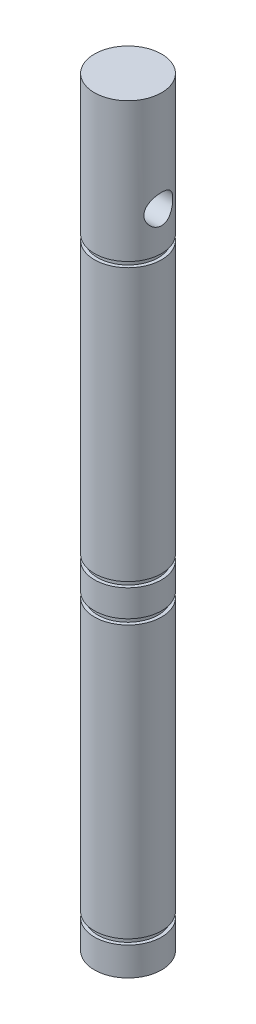
ISO-10303-21;
HEADER;
FILE_DESCRIPTION(('STEP AP214'),'2;1');
FILE_NAME('part.step','',(''),(''),'','','');
FILE_SCHEMA(('AUTOMOTIVE_DESIGN { 1 0 10303 214 1 1 1 1 }'));
ENDSEC;
DATA;
#1=APPLICATION_CONTEXT('core data for automotive mechanical design processes');
#2=APPLICATION_PROTOCOL_DEFINITION('international standard','automotive_design',2000,#1);
#3=PRODUCT_CONTEXT('',#1,'mechanical');
#4=PRODUCT('Part','Part','',(#3));
#5=PRODUCT_RELATED_PRODUCT_CATEGORY('part','',(#4));
#6=PRODUCT_DEFINITION_FORMATION('','',#4);
#7=PRODUCT_DEFINITION_CONTEXT('part definition',#1,'design');
#8=PRODUCT_DEFINITION('design','',#6,#7);
#9=PRODUCT_DEFINITION_SHAPE('','',#8);
#10=(LENGTH_UNIT() NAMED_UNIT(*) SI_UNIT(.MILLI.,.METRE.));
#11=(NAMED_UNIT(*) PLANE_ANGLE_UNIT() SI_UNIT($,.RADIAN.));
#12=(NAMED_UNIT(*) SI_UNIT($,.STERADIAN.) SOLID_ANGLE_UNIT());
#13=UNCERTAINTY_MEASURE_WITH_UNIT(LENGTH_MEASURE(1.E-05),#10,'distance_accuracy_value','');
#14=(GEOMETRIC_REPRESENTATION_CONTEXT(3) GLOBAL_UNCERTAINTY_ASSIGNED_CONTEXT((#13)) GLOBAL_UNIT_ASSIGNED_CONTEXT((#10,
#11,#12)) REPRESENTATION_CONTEXT('',''));
#15=CARTESIAN_POINT('',(0.,0.,0.));
#16=DIRECTION('',(0.,0.,1.));
#17=DIRECTION('',(1.,0.,0.));
#18=AXIS2_PLACEMENT_3D('',#15,#16,#17);
#19=CARTESIAN_POINT('',(0.,113.2,0.));
#20=DIRECTION('',(0.,-1.,0.));
#21=DIRECTION('',(0.,0.,-1.));
#22=AXIS2_PLACEMENT_3D('',#19,#20,#21);
#23=CYLINDRICAL_SURFACE('',#22,5.);
#24=CARTESIAN_POINT('',(5.,96.05,0.));
#25=CARTESIAN_POINT('',(4.99999621998049,96.0500047044788,0.114835545396068));
#26=CARTESIAN_POINT('',(4.99599926166422,96.0592544770341,0.229860735310637));
#27=CARTESIAN_POINT('',(4.98040992717606,96.0958968501132,0.456623046054586));
#28=CARTESIAN_POINT('',(4.96879845529822,96.1233350655641,0.568351160380434));
#29=CARTESIAN_POINT('',(4.93921683063638,96.1951496578611,0.784879505774936));
#30=CARTESIAN_POINT('',(4.92126879357173,96.2394671648934,0.889702346503161));
#31=CARTESIAN_POINT('',(4.88074740348192,96.3435285740351,1.09031746778291));
#32=CARTESIAN_POINT('',(4.85817528603951,96.4032683563248,1.18611215075088));
#33=CARTESIAN_POINT('',(4.80931422599573,96.5398020552537,1.37116513207813));
#34=CARTESIAN_POINT('',(4.78289851739489,96.6172795980927,1.45988525446503));
#35=CARTESIAN_POINT('',(4.72985518336361,96.7856413295159,1.62354093158267));
#36=CARTESIAN_POINT('',(4.70322744813478,96.8765329583648,1.69846878411878));
#37=CARTESIAN_POINT('',(4.65118303365362,97.0749943786449,1.8363607737916));
#38=CARTESIAN_POINT('',(4.62590609619846,97.1831941178272,1.89847662030886));
#39=CARTESIAN_POINT('',(4.5814531572261,97.4097462625302,2.00338646719045));
#40=CARTESIAN_POINT('',(4.56227381433804,97.5280930623435,2.04619105518083));
#41=CARTESIAN_POINT('',(4.53356873023215,97.7653850831066,2.10900450199364));
#42=CARTESIAN_POINT('',(4.52360556242213,97.8840001665593,2.13005258632579));
#43=CARTESIAN_POINT('',(4.51321267854591,98.1234645315574,2.15199319346716));
#44=CARTESIAN_POINT('',(4.51277719968365,98.2443124183203,2.15289789994809));
#45=CARTESIAN_POINT('',(4.52112117843054,98.4741381117304,2.1353050819531));
#46=CARTESIAN_POINT('',(4.52914196291459,98.5832714362591,2.11840504210957));
#47=CARTESIAN_POINT('',(4.55220547150226,98.7969689407392,2.06837520115208));
#48=CARTESIAN_POINT('',(4.56724964634381,98.9015321718185,2.03524204688745));
#49=CARTESIAN_POINT('',(4.60301000794308,99.105846989488,1.95303304687024));
#50=CARTESIAN_POINT('',(4.62384314004412,99.2054431571,1.90362411014709));
#51=CARTESIAN_POINT('',(4.6688110843489,99.3953345572334,1.79050331872356));
#52=CARTESIAN_POINT('',(4.69294724198725,99.4856259732038,1.72678562876736));
#53=CARTESIAN_POINT('',(4.74445845462428,99.6629521400752,1.58008857979551));
#54=CARTESIAN_POINT('',(4.77192887641005,99.7489514012745,1.49588741013984));
#55=CARTESIAN_POINT('',(4.82518045571716,99.9059691101634,1.31400448557392));
#56=CARTESIAN_POINT('',(4.85096116369323,99.9769835822411,1.2163191645282));
#57=CARTESIAN_POINT('',(4.8987679201725,100.103671228195,1.00691935021166));
#58=CARTESIAN_POINT('',(4.92067875720504,100.158896915273,0.894905848347731));
#59=CARTESIAN_POINT('',(4.95738082524822,100.24935221564,0.661994575906467));
#60=CARTESIAN_POINT('',(4.97217625256345,100.28459361684,0.541102090315633));
#61=CARTESIAN_POINT('',(4.99218074053255,100.33185191464,0.30249524146415));
#62=CARTESIAN_POINT('',(4.99796163404824,100.345256831367,0.185103758094274));
#63=CARTESIAN_POINT('',(5.00113087228178,100.352632295532,-0.050385312493932));
#64=CARTESIAN_POINT('',(4.99852182973699,100.346608893204,-0.168482668461244));
#65=CARTESIAN_POINT('',(4.98557160987261,100.316268481486,-0.395356668788955));
#66=CARTESIAN_POINT('',(4.97565231069721,100.292949172702,-0.50429363929419));
#67=CARTESIAN_POINT('',(4.94954183986369,100.230093262762,-0.716575344965289));
#68=CARTESIAN_POINT('',(4.93334988932626,100.19055464761,-0.819919383836166));
#69=CARTESIAN_POINT('',(4.89560311095936,100.095100853109,-1.02173568510502));
#70=CARTESIAN_POINT('',(4.87389656436943,100.038712705671,-1.11995493542662));
#71=CARTESIAN_POINT('',(4.82740593804048,99.9116774475739,-1.3058912611821));
#72=CARTESIAN_POINT('',(4.80262054337022,99.841024236401,-1.39360381772883));
#73=CARTESIAN_POINT('',(4.75030042593853,99.6812071479933,-1.56304009280931));
#74=CARTESIAN_POINT('',(4.7226997621419,99.5910457233874,-1.6438049355674));
#75=CARTESIAN_POINT('',(4.6695010423979,99.3980537215631,-1.7893516390723));
#76=CARTESIAN_POINT('',(4.64390355770015,99.2952195518092,-1.85412895189171));
#77=CARTESIAN_POINT('',(4.59732368381386,99.0771606660576,-1.96682915971184));
#78=CARTESIAN_POINT('',(4.57643497069984,98.9617426370537,-2.01441968381344));
#79=CARTESIAN_POINT('',(4.54285491722175,98.7233441971442,-2.08906077585787));
#80=CARTESIAN_POINT('',(4.53015622299322,98.6003706793471,-2.11612977403899));
#81=CARTESIAN_POINT('',(4.51556674498243,98.3610593110872,-2.14707307446202));
#82=CARTESIAN_POINT('',(4.51288536016702,98.24498849191,-2.15264527247689));
#83=CARTESIAN_POINT('',(4.51651061446972,98.0136196060097,-2.14502948633772));
#84=CARTESIAN_POINT('',(4.52281564143703,97.8983214044079,-2.13184486713354));
#85=CARTESIAN_POINT('',(4.54296104026491,97.6780657696047,-2.08854577765756));
#86=CARTESIAN_POINT('',(4.55638618236671,97.5728837290044,-2.05936148235166));
#87=CARTESIAN_POINT('',(4.58890714169607,97.3689016126893,-1.9858344356092));
#88=CARTESIAN_POINT('',(4.60800457331424,97.2701033636254,-1.94148736815147));
#89=CARTESIAN_POINT('',(4.65118848736616,97.0749779832801,-1.83572779733721));
#90=CARTESIAN_POINT('',(4.67551133474211,96.9791863999066,-1.77342570095996));
#91=CARTESIAN_POINT('',(4.72579153701387,96.798887648242,-1.63472692327571));
#92=CARTESIAN_POINT('',(4.75174951340188,96.714384809212,-1.55832486119464));
#93=CARTESIAN_POINT('',(4.80485732878053,96.5521235524419,-1.38638416406729));
#94=CARTESIAN_POINT('',(4.83193739760635,96.4754385713969,-1.28980595429324));
#95=CARTESIAN_POINT('',(4.88218823950585,96.3392808406513,-1.0841702666847));
#96=CARTESIAN_POINT('',(4.90535723816785,96.2798158947941,-0.975107162038187));
#97=CARTESIAN_POINT('',(4.9448973698972,96.1809562451619,-0.748982994819753));
#98=CARTESIAN_POINT('',(4.96136104370252,96.1412864900523,-0.632058730569331));
#99=CARTESIAN_POINT('',(4.9860123741463,96.0825624339776,-0.392520511405341));
#100=CARTESIAN_POINT('',(4.99422563086537,96.0634443505432,-0.269925398746322));
#101=CARTESIAN_POINT('',(4.99856494592615,96.0533399520735,-0.122288490351509));
#102=CARTESIAN_POINT('',(4.99910224315886,96.0520885408935,-0.0978529891005524));
#103=CARTESIAN_POINT('',(4.99982017425342,96.0504180606905,-0.0489478643300767));
#104=CARTESIAN_POINT('',(5.00000080574553,96.0499989971976,-0.0244782405849251));
#105=CARTESIAN_POINT('',(5.,96.05,0.));
#106=B_SPLINE_CURVE_WITH_KNOTS('',3,(#24,#25,#26,#27,#28,#29,#30,#31,#32,#33,#34,#35,#36,#37,
#38,#39,#40,#41,#42,#43,#44,#45,#46,#47,#48,#49,#50,#51,#52,#53,#54,#55,#56,#57,#58,#59,#60,#61,
#62,#63,#64,#65,#66,#67,#68,#69,#70,#71,#72,#73,#74,#75,#76,#77,#78,#79,#80,#81,#82,#83,#84,#85,
#86,#87,#88,#89,#90,#91,#92,#93,#94,#95,#96,#97,#98,#99,#100,#101,#102,#103,#104,#105),
.UNSPECIFIED.,.T.,.F.,(4,2,2,2,2,2,2,2,2,2,2,2,2,2,2,2,2,2,2,2,2,2,2,2,2,2,2,2,2,2,2,2,2,2,2,2,
2,2,2,2,4),(0.,0.344405597006514,0.689678215710457,1.03375749548488,1.37774495479789,
1.73832500006838,2.09910580181025,2.47907574725535,2.85883711575797,3.21947800432049,
3.57990075421401,3.91053324750237,4.24123406583687,4.57917351290039,4.91725102620772,
5.28594614852577,5.65473896663792,6.03313216257346,6.41130192707087,6.76433488987351,
7.11725792417767,7.45126692486654,7.78531741297642,8.12980247196889,8.4744351646423,
8.84520811413964,9.2160864151161,9.59379501860374,9.97116400148107,10.3180317835198,
10.6648373457531,10.9933406179796,11.3219374752747,11.6709643688181,12.0201247331079,
12.397098263593,12.774242366029,13.1459890606213,13.5165786721774,13.5899913687512,
13.6634045530858),.UNSPECIFIED.);
#107=CARTESIAN_POINT('',(5.,96.05,0.));
#108=VERTEX_POINT('',#107);
#109=EDGE_CURVE('E10',#108,#108,#106,.T.);
#110=ORIENTED_EDGE('',*,*,#109,.T.);
#111=EDGE_LOOP('',(#110));
#112=FACE_BOUND('',#111,.T.);
#113=CARTESIAN_POINT('',(-4.51414443721067,98.2,2.15));
#114=CARTESIAN_POINT('',(-4.51414951278014,98.0857200155741,2.1499952011723));
#115=CARTESIAN_POINT('',(-4.51854649410035,97.9712452678123,2.1408309105758));
#116=CARTESIAN_POINT('',(-4.53554937122718,97.7456351919812,2.10456046861167));
#117=CARTESIAN_POINT('',(-4.54817687545321,97.6345094621811,2.07740708557984));
#118=CARTESIAN_POINT('',(-4.57992971810558,97.4192624427461,2.00642324513826));
#119=CARTESIAN_POINT('',(-4.59902736038281,97.3151135270448,1.96266377759005));
#120=CARTESIAN_POINT('',(-4.64152659625833,97.1156639366798,1.85992207471281));
#121=CARTESIAN_POINT('',(-4.66492736585076,97.0203615732384,1.80094275296311));
#122=CARTESIAN_POINT('',(-4.71513199347882,96.8349298502471,1.66525156405259));
#123=CARTESIAN_POINT('',(-4.74205592060349,96.7454575266009,1.5876857868817));
#124=CARTESIAN_POINT('',(-4.79528949395647,96.5803014996709,1.41881424472759));
#125=CARTESIAN_POINT('',(-4.82159889053624,96.5046233180495,1.32750300415462));
#126=CARTESIAN_POINT('',(-4.87211471800527,96.3657743135881,1.12849717058419));
#127=CARTESIAN_POINT('',(-4.89616545073272,96.3033531099369,1.02023642237244));
#128=CARTESIAN_POINT('',(-4.93797190543764,96.1978961250329,0.793528306211398));
#129=CARTESIAN_POINT('',(-4.95573059351656,96.1548512071062,0.675085770817219));
#130=CARTESIAN_POINT('',(-4.98209872580232,96.0917821793645,0.438284704166239));
#131=CARTESIAN_POINT('',(-4.99115762385246,96.0706222237481,0.32027977922329));
#132=CARTESIAN_POINT('',(-5.00074482195632,96.0482430575654,0.0820702341816578));
#133=CARTESIAN_POINT('',(-5.00127682157101,96.0470151990677,-0.0381334092958198));
#134=CARTESIAN_POINT('',(-4.99400745661654,96.0639628256193,-0.26902891021177));
#135=CARTESIAN_POINT('',(-4.98674335464072,96.0808873069642,-0.379832762109613));
#136=CARTESIAN_POINT('',(-4.96544700416433,96.1315008513501,-0.596848897368903));
#137=CARTESIAN_POINT('',(-4.95141425538113,96.1651911535883,-0.703060840701902));
#138=CARTESIAN_POINT('',(-4.91765590806382,96.2487649327503,-0.909842433628477));
#139=CARTESIAN_POINT('',(-4.89784647740287,96.2988883260763,-1.01030086517808));
#140=CARTESIAN_POINT('',(-4.85445041992826,96.4136606884066,-1.2016451642771));
#141=CARTESIAN_POINT('',(-4.83086243477373,96.4783148844255,-1.29252756981954));
#142=CARTESIAN_POINT('',(-4.78018334295165,96.625896107597,-1.46932738620961));
#143=CARTESIAN_POINT('',(-4.75296217188764,96.7098245468116,-1.55437276682231));
#144=CARTESIAN_POINT('',(-4.69937364986633,96.8907732895118,-1.70957385226602));
#145=CARTESIAN_POINT('',(-4.67300667660388,96.9877992888736,-1.77972304468928));
#146=CARTESIAN_POINT('',(-4.62314748538469,97.196688550429,-1.90558897720018));
#147=CARTESIAN_POINT('',(-4.59979731496928,97.3089673035724,-1.96067736923769));
#148=CARTESIAN_POINT('',(-4.56033507532088,97.5424767579241,-2.05080297427647));
#149=CARTESIAN_POINT('',(-4.54421744268685,97.6637004946116,-2.08585560485617));
#150=CARTESIAN_POINT('',(-4.52245120064631,97.9029022566835,-2.13261829675214));
#151=CARTESIAN_POINT('',(-4.51616712555188,98.0205434834929,-2.14574930556149));
#152=CARTESIAN_POINT('',(-4.51295910381454,98.2564911466992,-2.15249214039399));
#153=CARTESIAN_POINT('',(-4.51603155136535,98.3747973093035,-2.14611148579632));
#154=CARTESIAN_POINT('',(-4.53053046357947,98.5999591257942,-2.11531088838087));
#155=CARTESIAN_POINT('',(-4.54135595236417,98.7070359498382,-2.09218741732136));
#156=CARTESIAN_POINT('',(-4.56935482088599,98.9156867449372,-2.03030566512492));
#157=CARTESIAN_POINT('',(-4.58652974988719,99.017259366025,-1.9915435679506));
#158=CARTESIAN_POINT('',(-4.62620100200519,99.2169780158314,-1.89762032631046));
#159=CARTESIAN_POINT('',(-4.64889670653137,99.3147815034786,-1.84181780906651));
#160=CARTESIAN_POINT('',(-4.69678548356889,99.5001254538218,-1.71602204080346));
#161=CARTESIAN_POINT('',(-4.72197968182488,99.5876612510825,-1.64602237800365));
#162=CARTESIAN_POINT('',(-4.77469384176465,99.7579890267374,-1.4865867009536));
#163=CARTESIAN_POINT('',(-4.80222384638618,99.8396902636284,-1.3959839920894));
#164=CARTESIAN_POINT('',(-4.85447564441542,99.9869473093736,-1.201737113603));
#165=CARTESIAN_POINT('',(-4.87919714672978,100.052501445447,-1.09809159447252));
#166=CARTESIAN_POINT('',(-4.92328396173559,100.165696561807,-0.879625341867552));
#167=CARTESIAN_POINT('',(-4.94262066314929,100.213242320902,-0.764749136878768));
#168=CARTESIAN_POINT('',(-4.97352234656936,100.287963863593,-0.527577393909156));
#169=CARTESIAN_POINT('',(-4.98509228791892,100.3151526471,-0.405286644872616));
#170=CARTESIAN_POINT('',(-4.9985529838069,100.346675021752,-0.166472416426177));
#171=CARTESIAN_POINT('',(-5.00109345734375,100.35254348575,-0.0501869173666038));
#172=CARTESIAN_POINT('',(-4.99804190993306,100.345445356958,0.181685627376727));
#173=CARTESIAN_POINT('',(-4.99245148436321,100.332482459102,0.297272805611062));
#174=CARTESIAN_POINT('',(-4.97411873093391,100.289190577532,0.51973195516458));
#175=CARTESIAN_POINT('',(-4.96166831032448,100.259569437656,0.626767793801491));
#176=CARTESIAN_POINT('',(-4.93102121101138,100.184599941053,0.834291424333676));
#177=CARTESIAN_POINT('',(-4.91282347902303,100.13924870139,0.934778011900853));
#178=CARTESIAN_POINT('',(-4.87139128006807,100.031807265208,1.13141708858936));
#179=CARTESIAN_POINT('',(-4.84796476994689,99.9690472987062,1.22716216428399));
#180=CARTESIAN_POINT('',(-4.79880942632248,99.8295189268503,1.40717790847987));
#181=CARTESIAN_POINT('',(-4.77307967770714,99.7527449408091,1.49144398236445));
#182=CARTESIAN_POINT('',(-4.71983432606251,99.5807595983443,1.65253756651391));
#183=CARTESIAN_POINT('',(-4.69232583131584,99.4846101210461,1.72836938896429));
#184=CARTESIAN_POINT('',(-4.64052231648642,99.2801424077738,1.86300158484658));
#185=CARTESIAN_POINT('',(-4.61622918154656,99.1718171014109,1.92179199084024));
#186=CARTESIAN_POINT('',(-4.57399339282844,98.9457949117303,2.02026445106465));
#187=CARTESIAN_POINT('',(-4.55604227578057,98.8281107766006,2.059971996618));
#188=CARTESIAN_POINT('',(-4.52912380685996,98.5868983424175,2.11851541176136));
#189=CARTESIAN_POINT('',(-4.52012632975352,98.4633911150298,2.13742129305104));
#190=CARTESIAN_POINT('',(-4.51557628845976,98.3160901915818,2.14699035128728));
#191=CARTESIAN_POINT('',(-4.51504039455016,98.2928920387724,2.14811794751018));
#192=CARTESIAN_POINT('',(-4.51432394990703,98.246465275047,2.14962326609005));
#193=CARTESIAN_POINT('',(-4.51414340519004,98.2232366636221,2.15000097575044));
#194=CARTESIAN_POINT('',(-4.51414443721067,98.2,2.15));
#195=B_SPLINE_CURVE_WITH_KNOTS('',3,(#113,#114,#115,#116,#117,#118,#119,#120,#121,#122,#123,
#124,#125,#126,#127,#128,#129,#130,#131,#132,#133,#134,#135,#136,#137,#138,#139,#140,#141,#142,
#143,#144,#145,#146,#147,#148,#149,#150,#151,#152,#153,#154,#155,#156,#157,#158,#159,#160,#161,
#162,#163,#164,#165,#166,#167,#168,#169,#170,#171,#172,#173,#174,#175,#176,#177,#178,#179,#180,
#181,#182,#183,#184,#185,#186,#187,#188,#189,#190,#191,#192,#193,#194),.UNSPECIFIED.,.T.,.F.,(4,
2,2,2,2,2,2,2,2,2,2,2,2,2,2,2,2,2,2,2,2,2,2,2,2,2,2,2,2,2,2,2,2,2,2,2,2,2,2,2,4),(0.,
0.342742032314596,0.686387544066338,1.02858024866375,1.37070749488558,1.73343576391697,
2.09630891223958,2.4761371287241,2.85578605330204,3.21455610923886,3.57317050158335,
3.90856861695379,4.24399152599019,4.58454745396594,4.92522608321965,5.29124323749678,
5.65742008146693,6.03711398064484,6.41651530952169,6.77020439920921,7.12375720184046,
7.45251543918697,7.78135394657962,8.12453131610273,8.46786401948768,8.84133168515923,
9.21483802445469,9.59029262625788,9.96550725877239,10.3131058704764,10.66063628846,
10.9944079230307,11.328240762002,11.6773169143528,12.0265323808931,12.401304540542,
12.7762954622558,13.1507840604647,13.5240083582031,13.5936972587871,13.6633873392859),.UNSPECIFIED.);
#196=CARTESIAN_POINT('',(-4.51414443721067,98.2,2.15));
#197=VERTEX_POINT('',#196);
#198=EDGE_CURVE('E44',#197,#197,#195,.T.);
#199=ORIENTED_EDGE('',*,*,#198,.T.);
#200=EDGE_LOOP('',(#199));
#201=FACE_BOUND('',#200,.T.);
#202=CARTESIAN_POINT('',(0.,113.2,0.));
#203=DIRECTION('',(0.,1.,0.));
#204=DIRECTION('',(0.,0.,1.));
#205=AXIS2_PLACEMENT_3D('',#202,#203,#204);
#206=CIRCLE('',#205,5.);
#207=CARTESIAN_POINT('',(0.,113.2,5.));
#208=VERTEX_POINT('',#207);
#209=EDGE_CURVE('E48',#208,#208,#206,.T.);
#210=ORIENTED_EDGE('',*,*,#209,.F.);
#211=EDGE_LOOP('',(#210));
#212=FACE_BOUND('',#211,.T.);
#213=CARTESIAN_POINT('',(0.,92.45,0.));
#214=DIRECTION('',(0.,-1.,0.));
#215=DIRECTION('',(0.,0.,-1.));
#216=AXIS2_PLACEMENT_3D('',#213,#214,#215);
#217=CIRCLE('',#216,5.);
#218=CARTESIAN_POINT('',(0.,92.45,-5.));
#219=VERTEX_POINT('',#218);
#220=EDGE_CURVE('E190',#219,#219,#217,.T.);
#221=ORIENTED_EDGE('',*,*,#220,.F.);
#222=EDGE_LOOP('',(#221));
#223=FACE_BOUND('',#222,.T.);
#224=ADVANCED_FACE('F32',(#112,#201,#212,#223),#23,.T.);
#225=CARTESIAN_POINT('',(0.,45.55,0.));
#226=DIRECTION('',(0.,-1.,0.));
#227=DIRECTION('',(0.,0.,-1.));
#228=AXIS2_PLACEMENT_3D('',#225,#226,#227);
#229=CIRCLE('',#228,5.);
#230=CARTESIAN_POINT('',(0.,45.55,-5.));
#231=VERTEX_POINT('',#230);
#232=EDGE_CURVE('E150',#231,#231,#229,.T.);
#233=ORIENTED_EDGE('',*,*,#232,.T.);
#234=EDGE_LOOP('',(#233));
#235=FACE_BOUND('',#234,.T.);
#236=CARTESIAN_POINT('',(0.,5.05,0.));
#237=DIRECTION('',(0.,-1.,0.));
#238=DIRECTION('',(0.,0.,-1.));
#239=AXIS2_PLACEMENT_3D('',#236,#237,#238);
#240=CIRCLE('',#239,5.);
#241=CARTESIAN_POINT('',(0.,5.05,-5.));
#242=VERTEX_POINT('',#241);
#243=EDGE_CURVE('E165',#242,#242,#240,.T.);
#244=ORIENTED_EDGE('',*,*,#243,.F.);
#245=EDGE_LOOP('',(#244));
#246=FACE_BOUND('',#245,.T.);
#247=ADVANCED_FACE('F112',(#235,#246),#23,.T.);
#248=CARTESIAN_POINT('',(0.,5.05,0.));
#249=DIRECTION('',(0.,-1.,0.));
#250=DIRECTION('',(0.,0.,-1.));
#251=AXIS2_PLACEMENT_3D('',#248,#249,#250);
#252=PLANE('',#251);
#253=CARTESIAN_POINT('',(0.,5.05,0.));
#254=DIRECTION('',(0.,-1.,0.));
#255=DIRECTION('',(0.,0.,-1.));
#256=AXIS2_PLACEMENT_3D('',#253,#254,#255);
#257=CIRCLE('',#256,4.5);
#258=CARTESIAN_POINT('',(0.,5.05,-4.5));
#259=VERTEX_POINT('',#258);
#260=EDGE_CURVE('E153',#259,#259,#257,.T.);
#261=ORIENTED_EDGE('',*,*,#260,.F.);
#262=EDGE_LOOP('',(#261));
#263=FACE_BOUND('',#262,.T.);
#264=ORIENTED_EDGE('',*,*,#243,.T.);
#265=EDGE_LOOP('',(#264));
#266=FACE_BOUND('',#265,.T.);
#267=ADVANCED_FACE('F109',(#263,#266),#252,.T.);
#268=CARTESIAN_POINT('',(0.,4.25,0.));
#269=DIRECTION('',(0.,-1.,0.));
#270=DIRECTION('',(0.,0.,-1.));
#271=AXIS2_PLACEMENT_3D('',#268,#269,#270);
#272=PLANE('',#271);
#273=CARTESIAN_POINT('',(0.,4.25,0.));
#274=DIRECTION('',(0.,-1.,0.));
#275=DIRECTION('',(0.,0.,-1.));
#276=AXIS2_PLACEMENT_3D('',#273,#274,#275);
#277=CIRCLE('',#276,4.5);
#278=CARTESIAN_POINT('',(0.,4.25,-4.5));
#279=VERTEX_POINT('',#278);
#280=EDGE_CURVE('E149',#279,#279,#277,.T.);
#281=ORIENTED_EDGE('',*,*,#280,.T.);
#282=EDGE_LOOP('',(#281));
#283=FACE_BOUND('',#282,.T.);
#284=CARTESIAN_POINT('',(0.,4.25,0.));
#285=DIRECTION('',(0.,-1.,0.));
#286=DIRECTION('',(0.,0.,-1.));
#287=AXIS2_PLACEMENT_3D('',#284,#285,#286);
#288=CIRCLE('',#287,5.);
#289=CARTESIAN_POINT('',(0.,4.25,-5.));
#290=VERTEX_POINT('',#289);
#291=EDGE_CURVE('E163',#290,#290,#288,.T.);
#292=ORIENTED_EDGE('',*,*,#291,.F.);
#293=EDGE_LOOP('',(#292));
#294=FACE_BOUND('',#293,.T.);
#295=ADVANCED_FACE('F107',(#283,#294),#272,.F.);
#296=CARTESIAN_POINT('',(0.,5.05,0.));
#297=DIRECTION('',(0.,-1.,0.));
#298=DIRECTION('',(0.,0.,-1.));
#299=AXIS2_PLACEMENT_3D('',#296,#297,#298);
#300=CYLINDRICAL_SURFACE('',#299,4.5);
#301=ORIENTED_EDGE('',*,*,#260,.T.);
#302=EDGE_LOOP('',(#301));
#303=FACE_BOUND('',#302,.T.);
#304=ORIENTED_EDGE('',*,*,#280,.F.);
#305=EDGE_LOOP('',(#304));
#306=FACE_BOUND('',#305,.T.);
#307=ADVANCED_FACE('F103',(#303,#306),#300,.T.);
#308=CARTESIAN_POINT('',(0.,0.,0.));
#309=DIRECTION('',(0.,1.,0.));
#310=DIRECTION('',(0.,0.,1.));
#311=AXIS2_PLACEMENT_3D('',#308,#309,#310);
#312=PLANE('',#311);
#313=CARTESIAN_POINT('',(0.,0.,0.));
#314=DIRECTION('',(0.,1.,0.));
#315=DIRECTION('',(0.,0.,1.));
#316=AXIS2_PLACEMENT_3D('',#313,#314,#315);
#317=CIRCLE('',#316,5.);
#318=CARTESIAN_POINT('',(0.,0.,5.));
#319=VERTEX_POINT('',#318);
#320=EDGE_CURVE('E52',#319,#319,#317,.T.);
#321=ORIENTED_EDGE('',*,*,#320,.F.);
#322=EDGE_LOOP('',(#321));
#323=FACE_BOUND('',#322,.T.);
#324=ADVANCED_FACE('F106',(#323),#312,.F.);
#325=ORIENTED_EDGE('',*,*,#291,.T.);
#326=EDGE_LOOP('',(#325));
#327=FACE_BOUND('',#326,.T.);
#328=ORIENTED_EDGE('',*,*,#320,.T.);
#329=EDGE_LOOP('',(#328));
#330=FACE_BOUND('',#329,.T.);
#331=ADVANCED_FACE('F34',(#327,#330),#23,.T.);
#332=CARTESIAN_POINT('',(0.,46.35,0.));
#333=DIRECTION('',(0.,-1.,0.));
#334=DIRECTION('',(0.,0.,-1.));
#335=AXIS2_PLACEMENT_3D('',#332,#333,#334);
#336=PLANE('',#335);
#337=CARTESIAN_POINT('',(0.,46.35,0.));
#338=DIRECTION('',(0.,-1.,0.));
#339=DIRECTION('',(0.,0.,-1.));
#340=AXIS2_PLACEMENT_3D('',#337,#338,#339);
#341=CIRCLE('',#340,4.5);
#342=CARTESIAN_POINT('',(0.,46.35,-4.5));
#343=VERTEX_POINT('',#342);
#344=EDGE_CURVE('E156',#343,#343,#341,.T.);
#345=ORIENTED_EDGE('',*,*,#344,.F.);
#346=EDGE_LOOP('',(#345));
#347=FACE_BOUND('',#346,.T.);
#348=CARTESIAN_POINT('',(0.,46.35,0.));
#349=DIRECTION('',(0.,-1.,0.));
#350=DIRECTION('',(0.,0.,-1.));
#351=AXIS2_PLACEMENT_3D('',#348,#349,#350);
#352=CIRCLE('',#351,5.);
#353=CARTESIAN_POINT('',(0.,46.35,-5.));
#354=VERTEX_POINT('',#353);
#355=EDGE_CURVE('E147',#354,#354,#352,.T.);
#356=ORIENTED_EDGE('',*,*,#355,.T.);
#357=EDGE_LOOP('',(#356));
#358=FACE_BOUND('',#357,.T.);
#359=ADVANCED_FACE('F96',(#347,#358),#336,.T.);
#360=CARTESIAN_POINT('',(0.,45.55,0.));
#361=DIRECTION('',(0.,-1.,0.));
#362=DIRECTION('',(0.,0.,-1.));
#363=AXIS2_PLACEMENT_3D('',#360,#361,#362);
#364=PLANE('',#363);
#365=CARTESIAN_POINT('',(0.,45.55,0.));
#366=DIRECTION('',(0.,-1.,0.));
#367=DIRECTION('',(0.,0.,-1.));
#368=AXIS2_PLACEMENT_3D('',#365,#366,#367);
#369=CIRCLE('',#368,4.5);
#370=CARTESIAN_POINT('',(0.,45.55,-4.5));
#371=VERTEX_POINT('',#370);
#372=EDGE_CURVE('E159',#371,#371,#369,.T.);
#373=ORIENTED_EDGE('',*,*,#372,.T.);
#374=EDGE_LOOP('',(#373));
#375=FACE_BOUND('',#374,.T.);
#376=ORIENTED_EDGE('',*,*,#232,.F.);
#377=EDGE_LOOP('',(#376));
#378=FACE_BOUND('',#377,.T.);
#379=ADVANCED_FACE('F94',(#375,#378),#364,.F.);
#380=CARTESIAN_POINT('',(0.,46.35,0.));
#381=DIRECTION('',(0.,-1.,0.));
#382=DIRECTION('',(0.,0.,-1.));
#383=AXIS2_PLACEMENT_3D('',#380,#381,#382);
#384=CYLINDRICAL_SURFACE('',#383,4.5);
#385=ORIENTED_EDGE('',*,*,#344,.T.);
#386=EDGE_LOOP('',(#385));
#387=FACE_BOUND('',#386,.T.);
#388=ORIENTED_EDGE('',*,*,#372,.F.);
#389=EDGE_LOOP('',(#388));
#390=FACE_BOUND('',#389,.T.);
#391=ADVANCED_FACE('F91',(#387,#390),#384,.T.);
#392=CARTESIAN_POINT('',(0.,50.35,0.));
#393=DIRECTION('',(0.,-1.,0.));
#394=DIRECTION('',(0.,0.,-1.));
#395=AXIS2_PLACEMENT_3D('',#392,#393,#394);
#396=CIRCLE('',#395,5.);
#397=CARTESIAN_POINT('',(0.,50.35,-5.));
#398=VERTEX_POINT('',#397);
#399=EDGE_CURVE('E144',#398,#398,#396,.T.);
#400=ORIENTED_EDGE('',*,*,#399,.T.);
#401=EDGE_LOOP('',(#400));
#402=FACE_BOUND('',#401,.T.);
#403=ORIENTED_EDGE('',*,*,#355,.F.);
#404=EDGE_LOOP('',(#403));
#405=FACE_BOUND('',#404,.T.);
#406=ADVANCED_FACE('F86',(#402,#405),#23,.T.);
#407=CARTESIAN_POINT('',(0.,51.15,0.));
#408=DIRECTION('',(0.,-1.,0.));
#409=DIRECTION('',(0.,0.,-1.));
#410=AXIS2_PLACEMENT_3D('',#407,#408,#409);
#411=PLANE('',#410);
#412=CARTESIAN_POINT('',(0.,51.15,0.));
#413=DIRECTION('',(0.,-1.,0.));
#414=DIRECTION('',(0.,0.,-1.));
#415=AXIS2_PLACEMENT_3D('',#412,#413,#414);
#416=CIRCLE('',#415,4.5);
#417=CARTESIAN_POINT('',(0.,51.15,-4.5));
#418=VERTEX_POINT('',#417);
#419=EDGE_CURVE('E184',#418,#418,#416,.T.);
#420=ORIENTED_EDGE('',*,*,#419,.F.);
#421=EDGE_LOOP('',(#420));
#422=FACE_BOUND('',#421,.T.);
#423=CARTESIAN_POINT('',(0.,51.15,0.));
#424=DIRECTION('',(0.,-1.,0.));
#425=DIRECTION('',(0.,0.,-1.));
#426=AXIS2_PLACEMENT_3D('',#423,#424,#425);
#427=CIRCLE('',#426,5.);
#428=CARTESIAN_POINT('',(0.,51.15,-5.));
#429=VERTEX_POINT('',#428);
#430=EDGE_CURVE('E180',#429,#429,#427,.T.);
#431=ORIENTED_EDGE('',*,*,#430,.T.);
#432=EDGE_LOOP('',(#431));
#433=FACE_BOUND('',#432,.T.);
#434=ADVANCED_FACE('F83',(#422,#433),#411,.T.);
#435=CARTESIAN_POINT('',(0.,50.35,0.));
#436=DIRECTION('',(0.,-1.,0.));
#437=DIRECTION('',(0.,0.,-1.));
#438=AXIS2_PLACEMENT_3D('',#435,#436,#437);
#439=PLANE('',#438);
#440=CARTESIAN_POINT('',(0.,50.35,0.));
#441=DIRECTION('',(0.,-1.,0.));
#442=DIRECTION('',(0.,0.,-1.));
#443=AXIS2_PLACEMENT_3D('',#440,#441,#442);
#444=CIRCLE('',#443,4.5);
#445=CARTESIAN_POINT('',(0.,50.35,-4.5));
#446=VERTEX_POINT('',#445);
#447=EDGE_CURVE('E187',#446,#446,#444,.T.);
#448=ORIENTED_EDGE('',*,*,#447,.T.);
#449=EDGE_LOOP('',(#448));
#450=FACE_BOUND('',#449,.T.);
#451=ORIENTED_EDGE('',*,*,#399,.F.);
#452=EDGE_LOOP('',(#451));
#453=FACE_BOUND('',#452,.T.);
#454=ADVANCED_FACE('F81',(#450,#453),#439,.F.);
#455=CARTESIAN_POINT('',(0.,51.15,0.));
#456=DIRECTION('',(0.,-1.,0.));
#457=DIRECTION('',(0.,0.,-1.));
#458=AXIS2_PLACEMENT_3D('',#455,#456,#457);
#459=CYLINDRICAL_SURFACE('',#458,4.5);
#460=ORIENTED_EDGE('',*,*,#419,.T.);
#461=EDGE_LOOP('',(#460));
#462=FACE_BOUND('',#461,.T.);
#463=ORIENTED_EDGE('',*,*,#447,.F.);
#464=EDGE_LOOP('',(#463));
#465=FACE_BOUND('',#464,.T.);
#466=ADVANCED_FACE('F78',(#462,#465),#459,.T.);
#467=CARTESIAN_POINT('',(0.,91.65,0.));
#468=DIRECTION('',(0.,-1.,0.));
#469=DIRECTION('',(0.,0.,-1.));
#470=AXIS2_PLACEMENT_3D('',#467,#468,#469);
#471=CIRCLE('',#470,5.);
#472=CARTESIAN_POINT('',(0.,91.65,-5.));
#473=VERTEX_POINT('',#472);
#474=EDGE_CURVE('E193',#473,#473,#471,.T.);
#475=ORIENTED_EDGE('',*,*,#474,.T.);
#476=EDGE_LOOP('',(#475));
#477=FACE_BOUND('',#476,.T.);
#478=ORIENTED_EDGE('',*,*,#430,.F.);
#479=EDGE_LOOP('',(#478));
#480=FACE_BOUND('',#479,.T.);
#481=ADVANCED_FACE('F73',(#477,#480),#23,.T.);
#482=CARTESIAN_POINT('',(0.,92.45,0.));
#483=DIRECTION('',(0.,-1.,0.));
#484=DIRECTION('',(0.,0.,-1.));
#485=AXIS2_PLACEMENT_3D('',#482,#483,#484);
#486=PLANE('',#485);
#487=CARTESIAN_POINT('',(0.,92.45,0.));
#488=DIRECTION('',(0.,-1.,0.));
#489=DIRECTION('',(0.,0.,-1.));
#490=AXIS2_PLACEMENT_3D('',#487,#488,#489);
#491=CIRCLE('',#490,4.5);
#492=CARTESIAN_POINT('',(0.,92.45,-4.5));
#493=VERTEX_POINT('',#492);
#494=EDGE_CURVE('E195',#493,#493,#491,.T.);
#495=ORIENTED_EDGE('',*,*,#494,.F.);
#496=EDGE_LOOP('',(#495));
#497=FACE_BOUND('',#496,.T.);
#498=ORIENTED_EDGE('',*,*,#220,.T.);
#499=EDGE_LOOP('',(#498));
#500=FACE_BOUND('',#499,.T.);
#501=ADVANCED_FACE('F70',(#497,#500),#486,.T.);
#502=CARTESIAN_POINT('',(0.,91.65,0.));
#503=DIRECTION('',(0.,-1.,0.));
#504=DIRECTION('',(0.,0.,-1.));
#505=AXIS2_PLACEMENT_3D('',#502,#503,#504);
#506=PLANE('',#505);
#507=CARTESIAN_POINT('',(0.,91.65,0.));
#508=DIRECTION('',(0.,-1.,0.));
#509=DIRECTION('',(0.,0.,-1.));
#510=AXIS2_PLACEMENT_3D('',#507,#508,#509);
#511=CIRCLE('',#510,4.5);
#512=CARTESIAN_POINT('',(0.,91.65,-4.5));
#513=VERTEX_POINT('',#512);
#514=EDGE_CURVE('E198',#513,#513,#511,.T.);
#515=ORIENTED_EDGE('',*,*,#514,.T.);
#516=EDGE_LOOP('',(#515));
#517=FACE_BOUND('',#516,.T.);
#518=ORIENTED_EDGE('',*,*,#474,.F.);
#519=EDGE_LOOP('',(#518));
#520=FACE_BOUND('',#519,.T.);
#521=ADVANCED_FACE('F68',(#517,#520),#506,.F.);
#522=CARTESIAN_POINT('',(0.,92.45,0.));
#523=DIRECTION('',(0.,-1.,0.));
#524=DIRECTION('',(0.,0.,-1.));
#525=AXIS2_PLACEMENT_3D('',#522,#523,#524);
#526=CYLINDRICAL_SURFACE('',#525,4.5);
#527=ORIENTED_EDGE('',*,*,#494,.T.);
#528=EDGE_LOOP('',(#527));
#529=FACE_BOUND('',#528,.T.);
#530=ORIENTED_EDGE('',*,*,#514,.F.);
#531=EDGE_LOOP('',(#530));
#532=FACE_BOUND('',#531,.T.);
#533=ADVANCED_FACE('F64',(#529,#532),#526,.T.);
#534=CARTESIAN_POINT('',(0.,113.2,0.));
#535=DIRECTION('',(0.,1.,0.));
#536=DIRECTION('',(0.,0.,1.));
#537=AXIS2_PLACEMENT_3D('',#534,#535,#536);
#538=PLANE('',#537);
#539=ORIENTED_EDGE('',*,*,#209,.T.);
#540=EDGE_LOOP('',(#539));
#541=FACE_BOUND('',#540,.T.);
#542=ADVANCED_FACE('F62',(#541),#538,.T.);
#543=CARTESIAN_POINT('',(-5.,98.2,0.));
#544=DIRECTION('',(-1.,0.,0.));
#545=DIRECTION('',(0.,0.,1.));
#546=AXIS2_PLACEMENT_3D('',#543,#544,#545);
#547=CYLINDRICAL_SURFACE('',#546,2.15);
#548=ORIENTED_EDGE('',*,*,#198,.F.);
#549=EDGE_LOOP('',(#548));
#550=FACE_BOUND('',#549,.T.);
#551=ORIENTED_EDGE('',*,*,#109,.F.);
#552=EDGE_LOOP('',(#551));
#553=FACE_BOUND('',#552,.T.);
#554=ADVANCED_FACE('F58',(#550,#553),#547,.F.);
#555=CLOSED_SHELL('',(#224,#247,#267,#295,#307,#324,#331,#359,#379,#391,#406,#434,#454,#466,
#481,#501,#521,#533,#542,#554));
#556=MANIFOLD_SOLID_BREP('B2',#555);
#557=ADVANCED_BREP_SHAPE_REPRESENTATION('',(#18,#556),#14);
#558=SHAPE_DEFINITION_REPRESENTATION(#9,#557);
ENDSEC;
END-ISO-10303-21;
